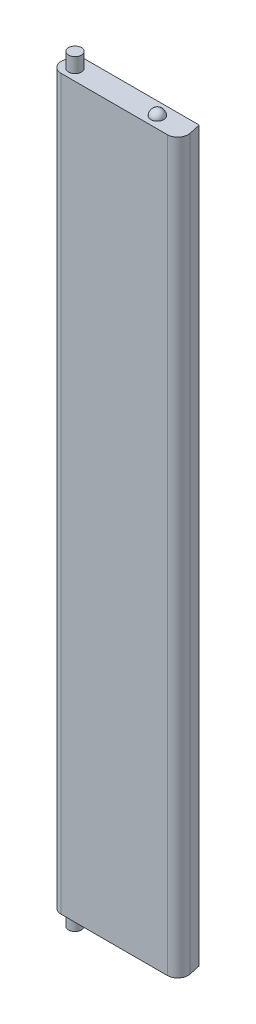
ISO-10303-21;
HEADER;
FILE_DESCRIPTION(('STEP AP214'),'2;1');
FILE_NAME('part.step','',(''),(''),'','','');
FILE_SCHEMA(('AUTOMOTIVE_DESIGN { 1 0 10303 214 1 1 1 1 }'));
ENDSEC;
DATA;
#1=APPLICATION_CONTEXT('core data for automotive mechanical design processes');
#2=APPLICATION_PROTOCOL_DEFINITION('international standard','automotive_design',2000,#1);
#3=PRODUCT_CONTEXT('',#1,'mechanical');
#4=PRODUCT('Part','Part','',(#3));
#5=PRODUCT_RELATED_PRODUCT_CATEGORY('part','',(#4));
#6=PRODUCT_DEFINITION_FORMATION('','',#4);
#7=PRODUCT_DEFINITION_CONTEXT('part definition',#1,'design');
#8=PRODUCT_DEFINITION('design','',#6,#7);
#9=PRODUCT_DEFINITION_SHAPE('','',#8);
#10=(LENGTH_UNIT() NAMED_UNIT(*) SI_UNIT(.MILLI.,.METRE.));
#11=(NAMED_UNIT(*) PLANE_ANGLE_UNIT() SI_UNIT($,.RADIAN.));
#12=(NAMED_UNIT(*) SI_UNIT($,.STERADIAN.) SOLID_ANGLE_UNIT());
#13=UNCERTAINTY_MEASURE_WITH_UNIT(LENGTH_MEASURE(1.E-05),#10,'distance_accuracy_value','');
#14=(GEOMETRIC_REPRESENTATION_CONTEXT(3) GLOBAL_UNCERTAINTY_ASSIGNED_CONTEXT((#13)) GLOBAL_UNIT_ASSIGNED_CONTEXT((#10,
#11,#12)) REPRESENTATION_CONTEXT('',''));
#15=CARTESIAN_POINT('',(0.,0.,0.));
#16=DIRECTION('',(0.,0.,1.));
#17=DIRECTION('',(1.,0.,0.));
#18=AXIS2_PLACEMENT_3D('',#15,#16,#17);
#19=CARTESIAN_POINT('',(87.875,0.95,16.1));
#20=DIRECTION('',(0.,0.,1.));
#21=DIRECTION('',(1.,0.,0.));
#22=AXIS2_PLACEMENT_3D('',#19,#20,#21);
#23=PLANE('',#22);
#24=DIRECTION('',(0.,1.,0.));
#25=VECTOR('',#24,1.);
#26=CARTESIAN_POINT('',(83.075,41.55,16.1));
#27=LINE('',#26,#25);
#28=CARTESIAN_POINT('',(83.075,41.55,16.1));
#29=VERTEX_POINT('',#28);
#30=CARTESIAN_POINT('',(83.075,-39.65,16.1));
#31=VERTEX_POINT('',#30);
#32=EDGE_CURVE('E272',#29,#31,#27,.F.);
#33=ORIENTED_EDGE('',*,*,#32,.F.);
#34=DIRECTION('',(1.,0.,0.));
#35=VECTOR('',#34,1.);
#36=CARTESIAN_POINT('',(92.675,41.55,16.1));
#37=LINE('',#36,#35);
#38=CARTESIAN_POINT('',(92.675,41.55,16.1));
#39=VERTEX_POINT('',#38);
#40=EDGE_CURVE('E260',#39,#29,#37,.F.);
#41=ORIENTED_EDGE('',*,*,#40,.F.);
#42=DIRECTION('',(0.,-1.,0.));
#43=VECTOR('',#42,1.);
#44=CARTESIAN_POINT('',(92.675,-39.65,16.1));
#45=LINE('',#44,#43);
#46=CARTESIAN_POINT('',(92.675,-39.65,16.1));
#47=VERTEX_POINT('',#46);
#48=EDGE_CURVE('E284',#47,#39,#45,.F.);
#49=ORIENTED_EDGE('',*,*,#48,.F.);
#50=DIRECTION('',(-1.,0.,0.));
#51=VECTOR('',#50,1.);
#52=CARTESIAN_POINT('',(83.075,-39.65,16.1));
#53=LINE('',#52,#51);
#54=EDGE_CURVE('E282',#31,#47,#53,.F.);
#55=ORIENTED_EDGE('',*,*,#54,.F.);
#56=EDGE_LOOP('',(#33,#41,#49,#55));
#57=FACE_BOUND('',#56,.T.);
#58=ADVANCED_FACE('F17',(#57),#23,.F.);
#59=CARTESIAN_POINT('',(82.05,44.65,16.));
#60=DIRECTION('',(0.,1.,0.));
#61=DIRECTION('',(-1.,0.,0.));
#62=AXIS2_PLACEMENT_3D('',#59,#60,#61);
#63=PLANE('',#62);
#64=CARTESIAN_POINT('',(82.0500000000001,44.65,16.));
#65=DIRECTION('',(0.,-1.,0.));
#66=DIRECTION('',(1.,0.,0.));
#67=AXIS2_PLACEMENT_3D('',#64,#65,#66);
#68=CIRCLE('',#67,0.75);
#69=CARTESIAN_POINT('',(82.8000000000001,44.65,16.));
#70=VERTEX_POINT('',#69);
#71=EDGE_CURVE('E20',#70,#70,#68,.T.);
#72=ORIENTED_EDGE('',*,*,#71,.F.);
#73=EDGE_LOOP('',(#72));
#74=FACE_BOUND('',#73,.T.);
#75=ADVANCED_FACE('F177',(#74),#63,.T.);
#76=CARTESIAN_POINT('',(92.675,-39.65,14.5));
#77=DIRECTION('',(-1.,0.,0.));
#78=DIRECTION('',(0.,-1.,0.));
#79=AXIS2_PLACEMENT_3D('',#76,#77,#78);
#80=PLANE('',#79);
#81=DIRECTION('',(0.,0.,1.));
#82=VECTOR('',#81,1.);
#83=CARTESIAN_POINT('',(92.675,41.55,14.5));
#84=LINE('',#83,#82);
#85=CARTESIAN_POINT('',(92.675,41.55,14.5));
#86=VERTEX_POINT('',#85);
#87=EDGE_CURVE('E274',#86,#39,#84,.T.);
#88=ORIENTED_EDGE('',*,*,#87,.F.);
#89=DIRECTION('',(0.,1.,0.));
#90=VECTOR('',#89,1.);
#91=CARTESIAN_POINT('',(92.675,-41.05,14.5));
#92=LINE('',#91,#90);
#93=CARTESIAN_POINT('',(92.675,-39.65,14.5));
#94=VERTEX_POINT('',#93);
#95=EDGE_CURVE('E134',#86,#94,#92,.F.);
#96=ORIENTED_EDGE('',*,*,#95,.T.);
#97=DIRECTION('',(0.,0.,1.));
#98=VECTOR('',#97,1.);
#99=CARTESIAN_POINT('',(92.675,-39.65,14.5));
#100=LINE('',#99,#98);
#101=EDGE_CURVE('E277',#47,#94,#100,.F.);
#102=ORIENTED_EDGE('',*,*,#101,.F.);
#103=ORIENTED_EDGE('',*,*,#48,.T.);
#104=EDGE_LOOP('',(#88,#96,#102,#103));
#105=FACE_BOUND('',#104,.T.);
#106=ADVANCED_FACE('F174',(#105),#80,.T.);
#107=CARTESIAN_POINT('',(83.075,-39.65,14.5));
#108=DIRECTION('',(0.,1.,0.));
#109=DIRECTION('',(-1.,0.,0.));
#110=AXIS2_PLACEMENT_3D('',#107,#108,#109);
#111=PLANE('',#110);
#112=ORIENTED_EDGE('',*,*,#101,.T.);
#113=DIRECTION('',(1.,0.,0.));
#114=VECTOR('',#113,1.);
#115=CARTESIAN_POINT('',(94.875,-39.65,14.5));
#116=LINE('',#115,#114);
#117=CARTESIAN_POINT('',(83.075,-39.65,14.5));
#118=VERTEX_POINT('',#117);
#119=EDGE_CURVE('E128',#94,#118,#116,.F.);
#120=ORIENTED_EDGE('',*,*,#119,.T.);
#121=DIRECTION('',(0.,0.,1.));
#122=VECTOR('',#121,1.);
#123=CARTESIAN_POINT('',(83.075,-39.65,14.5));
#124=LINE('',#123,#122);
#125=EDGE_CURVE('E271',#31,#118,#124,.F.);
#126=ORIENTED_EDGE('',*,*,#125,.F.);
#127=ORIENTED_EDGE('',*,*,#54,.T.);
#128=EDGE_LOOP('',(#112,#120,#126,#127));
#129=FACE_BOUND('',#128,.T.);
#130=ADVANCED_FACE('F170',(#129),#111,.T.);
#131=CARTESIAN_POINT('',(83.075,41.55,14.5));
#132=DIRECTION('',(1.,0.,0.));
#133=DIRECTION('',(0.,1.,0.));
#134=AXIS2_PLACEMENT_3D('',#131,#132,#133);
#135=PLANE('',#134);
#136=ORIENTED_EDGE('',*,*,#125,.T.);
#137=DIRECTION('',(0.,1.,0.));
#138=VECTOR('',#137,1.);
#139=CARTESIAN_POINT('',(83.075,-41.05,14.5));
#140=LINE('',#139,#138);
#141=CARTESIAN_POINT('',(83.075,41.55,14.5));
#142=VERTEX_POINT('',#141);
#143=EDGE_CURVE('E120',#118,#142,#140,.T.);
#144=ORIENTED_EDGE('',*,*,#143,.T.);
#145=DIRECTION('',(0.,0.,1.));
#146=VECTOR('',#145,1.);
#147=CARTESIAN_POINT('',(83.075,41.55,14.5));
#148=LINE('',#147,#146);
#149=EDGE_CURVE('E258',#29,#142,#148,.F.);
#150=ORIENTED_EDGE('',*,*,#149,.F.);
#151=ORIENTED_EDGE('',*,*,#32,.T.);
#152=EDGE_LOOP('',(#136,#144,#150,#151));
#153=FACE_BOUND('',#152,.T.);
#154=ADVANCED_FACE('F167',(#153),#135,.T.);
#155=CARTESIAN_POINT('',(92.675,41.55,14.5));
#156=DIRECTION('',(0.,-1.,0.));
#157=DIRECTION('',(1.,0.,0.));
#158=AXIS2_PLACEMENT_3D('',#155,#156,#157);
#159=PLANE('',#158);
#160=ORIENTED_EDGE('',*,*,#149,.T.);
#161=DIRECTION('',(1.,0.,0.));
#162=VECTOR('',#161,1.);
#163=CARTESIAN_POINT('',(94.875,41.55,14.5));
#164=LINE('',#163,#162);
#165=EDGE_CURVE('E114',#142,#86,#164,.T.);
#166=ORIENTED_EDGE('',*,*,#165,.T.);
#167=ORIENTED_EDGE('',*,*,#87,.T.);
#168=ORIENTED_EDGE('',*,*,#40,.T.);
#169=EDGE_LOOP('',(#160,#166,#167,#168));
#170=FACE_BOUND('',#169,.T.);
#171=ADVANCED_FACE('F163',(#170),#159,.T.);
#172=CARTESIAN_POINT('',(82.05,-42.75,16.));
#173=DIRECTION('',(0.,1.,0.));
#174=DIRECTION('',(-1.,0.,0.));
#175=AXIS2_PLACEMENT_3D('',#172,#173,#174);
#176=PLANE('',#175);
#177=CARTESIAN_POINT('',(82.05,-42.75,16.));
#178=DIRECTION('',(0.,-1.,0.));
#179=DIRECTION('',(1.,0.,0.));
#180=AXIS2_PLACEMENT_3D('',#177,#178,#179);
#181=CIRCLE('',#180,0.75);
#182=CARTESIAN_POINT('',(82.8,-42.75,16.));
#183=VERTEX_POINT('',#182);
#184=EDGE_CURVE('E112',#183,#183,#181,.F.);
#185=ORIENTED_EDGE('',*,*,#184,.F.);
#186=EDGE_LOOP('',(#185));
#187=FACE_BOUND('',#186,.T.);
#188=ADVANCED_FACE('F159',(#187),#176,.F.);
#189=CARTESIAN_POINT('',(80.875,-41.05,14.5));
#190=DIRECTION('',(0.976384584304589,0.,0.216039680457909));
#191=DIRECTION('',(0.216039680457909,0.,-0.976384584304589));
#192=AXIS2_PLACEMENT_3D('',#189,#190,#191);
#193=PLANE('',#192);
#194=DIRECTION('',(0.,-1.,0.));
#195=VECTOR('',#194,1.);
#196=CARTESIAN_POINT('',(80.5783384988346,-41.05,15.84075238345));
#197=LINE('',#196,#195);
#198=CARTESIAN_POINT('',(80.578338498835,42.95,15.8407523834503));
#199=VERTEX_POINT('',#198);
#200=CARTESIAN_POINT('',(80.578338498835,-41.05,15.8407523834503));
#201=VERTEX_POINT('',#200);
#202=EDGE_CURVE('E94',#199,#201,#197,.T.);
#203=ORIENTED_EDGE('',*,*,#202,.F.);
#204=DIRECTION('',(0.216039680457909,0.,-0.976384584304589));
#205=VECTOR('',#204,1.);
#206=CARTESIAN_POINT('',(80.875,42.95,14.5));
#207=LINE('',#206,#205);
#208=CARTESIAN_POINT('',(80.875,42.95,14.5));
#209=VERTEX_POINT('',#208);
#210=EDGE_CURVE('E262',#209,#199,#207,.F.);
#211=ORIENTED_EDGE('',*,*,#210,.F.);
#212=DIRECTION('',(0.,1.,0.));
#213=VECTOR('',#212,1.);
#214=CARTESIAN_POINT('',(80.875,-41.05,14.5));
#215=LINE('',#214,#213);
#216=CARTESIAN_POINT('',(80.875,-41.05,14.5));
#217=VERTEX_POINT('',#216);
#218=EDGE_CURVE('E136',#209,#217,#215,.F.);
#219=ORIENTED_EDGE('',*,*,#218,.T.);
#220=DIRECTION('',(0.216039680457909,0.,-0.976384584304589));
#221=VECTOR('',#220,1.);
#222=CARTESIAN_POINT('',(80.875,-41.05,14.5));
#223=LINE('',#222,#221);
#224=EDGE_CURVE('E229',#201,#217,#223,.T.);
#225=ORIENTED_EDGE('',*,*,#224,.F.);
#226=EDGE_LOOP('',(#203,#211,#219,#225));
#227=FACE_BOUND('',#226,.T.);
#228=ADVANCED_FACE('F155',(#227),#193,.F.);
#229=CARTESIAN_POINT('',(82.05,-42.75,16.));
#230=DIRECTION('',(0.,-1.,0.));
#231=DIRECTION('',(1.,0.,0.));
#232=AXIS2_PLACEMENT_3D('',#229,#230,#231);
#233=CYLINDRICAL_SURFACE('',#232,0.75);
#234=ORIENTED_EDGE('',*,*,#71,.T.);
#235=EDGE_LOOP('',(#234));
#236=FACE_BOUND('',#235,.T.);
#237=CARTESIAN_POINT('',(82.0500000000001,42.95,16.));
#238=DIRECTION('',(0.,-1.,0.));
#239=DIRECTION('',(1.,0.,0.));
#240=AXIS2_PLACEMENT_3D('',#237,#238,#239);
#241=CIRCLE('',#240,0.75);
#242=CARTESIAN_POINT('',(82.8000000000001,42.95,16.));
#243=VERTEX_POINT('',#242);
#244=EDGE_CURVE('E108',#243,#243,#241,.T.);
#245=ORIENTED_EDGE('',*,*,#244,.F.);
#246=EDGE_LOOP('',(#245));
#247=FACE_BOUND('',#246,.T.);
#248=ADVANCED_FACE('F150',(#236,#247),#233,.T.);
#249=CARTESIAN_POINT('',(91.55,42.95,16.));
#250=DIRECTION('',(1.,0.,0.));
#251=DIRECTION('',(0.,0.,-1.));
#252=AXIS2_PLACEMENT_3D('',#249,#250,#251);
#253=SPHERICAL_SURFACE('',#252,0.75);
#254=CARTESIAN_POINT('',(91.55,42.95,16.));
#255=DIRECTION('',(0.,-1.,0.));
#256=DIRECTION('',(1.,0.,0.));
#257=AXIS2_PLACEMENT_3D('',#254,#255,#256);
#258=CIRCLE('',#257,0.75);
#259=CARTESIAN_POINT('',(92.3,42.95,16.));
#260=VERTEX_POINT('',#259);
#261=CARTESIAN_POINT('',(90.8,42.95,16.));
#262=VERTEX_POINT('',#261);
#263=EDGE_CURVE('E33',#260,#262,#258,.T.);
#264=ORIENTED_EDGE('',*,*,#263,.F.);
#265=CARTESIAN_POINT('',(91.55,42.95,16.));
#266=DIRECTION('',(0.,-1.,0.));
#267=DIRECTION('',(1.,0.,0.));
#268=AXIS2_PLACEMENT_3D('',#265,#266,#267);
#269=CIRCLE('',#268,0.75);
#270=EDGE_CURVE('E106',#262,#260,#269,.T.);
#271=ORIENTED_EDGE('',*,*,#270,.F.);
#272=EDGE_LOOP('',(#264,#271));
#273=FACE_BOUND('',#272,.T.);
#274=ADVANCED_FACE('F146',(#273),#253,.T.);
#275=CARTESIAN_POINT('',(95.171661501165,-41.05,15.84075238345));
#276=DIRECTION('',(-0.976384584304589,0.,0.216039680457909));
#277=DIRECTION('',(0.216039680457909,0.,0.976384584304589));
#278=AXIS2_PLACEMENT_3D('',#275,#276,#277);
#279=PLANE('',#278);
#280=DIRECTION('',(0.,1.,0.));
#281=VECTOR('',#280,1.);
#282=CARTESIAN_POINT('',(94.875,-41.05,14.5));
#283=LINE('',#282,#281);
#284=CARTESIAN_POINT('',(94.8750000000002,-41.05,14.5));
#285=VERTEX_POINT('',#284);
#286=CARTESIAN_POINT('',(94.875,42.95,14.5));
#287=VERTEX_POINT('',#286);
#288=EDGE_CURVE('E89',#285,#287,#283,.T.);
#289=ORIENTED_EDGE('',*,*,#288,.T.);
#290=DIRECTION('',(-0.216039680458227,0.,-0.976384584304518));
#291=VECTOR('',#290,1.);
#292=CARTESIAN_POINT('',(95.171661501165,42.95,15.84075238345));
#293=LINE('',#292,#291);
#294=CARTESIAN_POINT('',(95.1716615011652,42.95,15.84075238345));
#295=VERTEX_POINT('',#294);
#296=EDGE_CURVE('E85',#295,#287,#293,.T.);
#297=ORIENTED_EDGE('',*,*,#296,.F.);
#298=DIRECTION('',(0.,-1.,0.));
#299=VECTOR('',#298,1.);
#300=CARTESIAN_POINT('',(95.1716615011654,-41.05,15.8407523834499));
#301=LINE('',#300,#299);
#302=CARTESIAN_POINT('',(95.1716615011652,-41.05,15.8407523834503));
#303=VERTEX_POINT('',#302);
#304=EDGE_CURVE('E73',#303,#295,#301,.F.);
#305=ORIENTED_EDGE('',*,*,#304,.F.);
#306=DIRECTION('',(0.216039680457909,0.,0.976384584304589));
#307=VECTOR('',#306,1.);
#308=CARTESIAN_POINT('',(95.171661501165,-41.05,15.84075238345));
#309=LINE('',#308,#307);
#310=EDGE_CURVE('E138',#285,#303,#309,.T.);
#311=ORIENTED_EDGE('',*,*,#310,.F.);
#312=EDGE_LOOP('',(#289,#297,#305,#311));
#313=FACE_BOUND('',#312,.T.);
#314=ADVANCED_FACE('F86',(#313),#279,.F.);
#315=CARTESIAN_POINT('',(94.875,-41.05,14.5));
#316=DIRECTION('',(0.,0.,1.));
#317=DIRECTION('',(1.,0.,0.));
#318=AXIS2_PLACEMENT_3D('',#315,#316,#317);
#319=PLANE('',#318);
#320=ORIENTED_EDGE('',*,*,#143,.F.);
#321=ORIENTED_EDGE('',*,*,#119,.F.);
#322=ORIENTED_EDGE('',*,*,#95,.F.);
#323=ORIENTED_EDGE('',*,*,#165,.F.);
#324=EDGE_LOOP('',(#320,#321,#322,#323));
#325=FACE_BOUND('',#324,.T.);
#326=ORIENTED_EDGE('',*,*,#218,.F.);
#327=DIRECTION('',(-1.,0.,0.));
#328=VECTOR('',#327,1.);
#329=CARTESIAN_POINT('',(87.875,42.95,14.5));
#330=LINE('',#329,#328);
#331=EDGE_CURVE('E93',#287,#209,#330,.T.);
#332=ORIENTED_EDGE('',*,*,#331,.F.);
#333=ORIENTED_EDGE('',*,*,#288,.F.);
#334=DIRECTION('',(-1.,0.,0.));
#335=VECTOR('',#334,1.);
#336=CARTESIAN_POINT('',(87.875,-41.05,14.5));
#337=LINE('',#336,#335);
#338=EDGE_CURVE('E101',#285,#217,#337,.T.);
#339=ORIENTED_EDGE('',*,*,#338,.T.);
#340=EDGE_LOOP('',(#326,#332,#333,#339));
#341=FACE_BOUND('',#340,.T.);
#342=ADVANCED_FACE('F266',(#325,#341),#319,.F.);
#343=CARTESIAN_POINT('',(82.05,-42.75,16.));
#344=DIRECTION('',(0.,-1.,0.));
#345=DIRECTION('',(1.,0.,0.));
#346=AXIS2_PLACEMENT_3D('',#343,#344,#345);
#347=CYLINDRICAL_SURFACE('',#346,0.75);
#348=CARTESIAN_POINT('',(82.05,-41.05,16.));
#349=DIRECTION('',(0.,-1.,0.));
#350=DIRECTION('',(1.,0.,0.));
#351=AXIS2_PLACEMENT_3D('',#348,#349,#350);
#352=CIRCLE('',#351,0.75);
#353=CARTESIAN_POINT('',(82.8,-41.05,16.));
#354=VERTEX_POINT('',#353);
#355=EDGE_CURVE('E295',#354,#354,#352,.T.);
#356=ORIENTED_EDGE('',*,*,#355,.T.);
#357=EDGE_LOOP('',(#356));
#358=FACE_BOUND('',#357,.T.);
#359=ORIENTED_EDGE('',*,*,#184,.T.);
#360=EDGE_LOOP('',(#359));
#361=FACE_BOUND('',#360,.T.);
#362=ADVANCED_FACE('F208',(#358,#361),#347,.T.);
#363=CARTESIAN_POINT('',(91.55,-41.05,16.));
#364=DIRECTION('',(1.,0.,0.));
#365=DIRECTION('',(0.,0.,1.));
#366=AXIS2_PLACEMENT_3D('',#363,#364,#365);
#367=SPHERICAL_SURFACE('',#366,0.75);
#368=CARTESIAN_POINT('',(91.55,-41.05,16.));
#369=DIRECTION('',(0.,-1.,0.));
#370=DIRECTION('',(1.,0.,0.));
#371=AXIS2_PLACEMENT_3D('',#368,#369,#370);
#372=CIRCLE('',#371,0.75);
#373=CARTESIAN_POINT('',(90.8,-41.05,16.));
#374=VERTEX_POINT('',#373);
#375=CARTESIAN_POINT('',(92.3,-41.05,16.));
#376=VERTEX_POINT('',#375);
#377=EDGE_CURVE('E217',#374,#376,#372,.T.);
#378=ORIENTED_EDGE('',*,*,#377,.T.);
#379=CARTESIAN_POINT('',(91.55,-41.05,16.));
#380=DIRECTION('',(0.,-1.,0.));
#381=DIRECTION('',(1.,0.,0.));
#382=AXIS2_PLACEMENT_3D('',#379,#380,#381);
#383=CIRCLE('',#382,0.75);
#384=EDGE_CURVE('E54',#376,#374,#383,.T.);
#385=ORIENTED_EDGE('',*,*,#384,.T.);
#386=EDGE_LOOP('',(#378,#385));
#387=FACE_BOUND('',#386,.T.);
#388=ADVANCED_FACE('F204',(#387),#367,.T.);
#389=CARTESIAN_POINT('',(81.75,-41.05,16.1));
#390=DIRECTION('',(0.,-1.,0.));
#391=DIRECTION('',(1.,0.,0.));
#392=AXIS2_PLACEMENT_3D('',#389,#390,#391);
#393=CYLINDRICAL_SURFACE('',#392,1.2);
#394=CARTESIAN_POINT('',(81.7500000000001,42.95,16.1));
#395=DIRECTION('',(0.,-1.,0.));
#396=DIRECTION('',(1.,0.,0.));
#397=AXIS2_PLACEMENT_3D('',#394,#395,#396);
#398=CIRCLE('',#397,1.2);
#399=CARTESIAN_POINT('',(81.75,42.95,17.3));
#400=VERTEX_POINT('',#399);
#401=EDGE_CURVE('E111',#199,#400,#398,.F.);
#402=ORIENTED_EDGE('',*,*,#401,.F.);
#403=ORIENTED_EDGE('',*,*,#202,.T.);
#404=CARTESIAN_POINT('',(81.75,-41.05,16.1));
#405=DIRECTION('',(0.,-1.,0.));
#406=DIRECTION('',(1.,0.,0.));
#407=AXIS2_PLACEMENT_3D('',#404,#405,#406);
#408=CIRCLE('',#407,1.2);
#409=CARTESIAN_POINT('',(81.75,-41.05,17.3));
#410=VERTEX_POINT('',#409);
#411=EDGE_CURVE('E224',#201,#410,#408,.F.);
#412=ORIENTED_EDGE('',*,*,#411,.T.);
#413=DIRECTION('',(0.,1.,0.));
#414=VECTOR('',#413,1.);
#415=CARTESIAN_POINT('',(81.75,-41.05,17.3));
#416=LINE('',#415,#414);
#417=EDGE_CURVE('E215',#410,#400,#416,.T.);
#418=ORIENTED_EDGE('',*,*,#417,.T.);
#419=EDGE_LOOP('',(#402,#403,#412,#418));
#420=FACE_BOUND('',#419,.T.);
#421=ADVANCED_FACE('F201',(#420),#393,.T.);
#422=CARTESIAN_POINT('',(87.875,42.95,15.872310861159));
#423=DIRECTION('',(0.,1.,0.));
#424=DIRECTION('',(-1.,0.,0.));
#425=AXIS2_PLACEMENT_3D('',#422,#423,#424);
#426=PLANE('',#425);
#427=ORIENTED_EDGE('',*,*,#263,.T.);
#428=ORIENTED_EDGE('',*,*,#270,.T.);
#429=EDGE_LOOP('',(#427,#428));
#430=FACE_BOUND('',#429,.T.);
#431=ORIENTED_EDGE('',*,*,#244,.T.);
#432=EDGE_LOOP('',(#431));
#433=FACE_BOUND('',#432,.T.);
#434=ORIENTED_EDGE('',*,*,#210,.T.);
#435=ORIENTED_EDGE('',*,*,#401,.T.);
#436=DIRECTION('',(-1.,0.,0.));
#437=VECTOR('',#436,1.);
#438=CARTESIAN_POINT('',(81.75,42.95,17.3));
#439=LINE('',#438,#437);
#440=CARTESIAN_POINT('',(94.,42.95,17.3));
#441=VERTEX_POINT('',#440);
#442=EDGE_CURVE('E99',#400,#441,#439,.F.);
#443=ORIENTED_EDGE('',*,*,#442,.T.);
#444=CARTESIAN_POINT('',(94.0000000000001,42.95,16.1));
#445=DIRECTION('',(0.,-1.,0.));
#446=DIRECTION('',(1.,0.,0.));
#447=AXIS2_PLACEMENT_3D('',#444,#445,#446);
#448=CIRCLE('',#447,1.2);
#449=EDGE_CURVE('E78',#295,#441,#448,.T.);
#450=ORIENTED_EDGE('',*,*,#449,.F.);
#451=ORIENTED_EDGE('',*,*,#296,.T.);
#452=ORIENTED_EDGE('',*,*,#331,.T.);
#453=EDGE_LOOP('',(#434,#435,#443,#450,#451,#452));
#454=FACE_BOUND('',#453,.T.);
#455=ADVANCED_FACE('F97',(#430,#433,#454),#426,.T.);
#456=CARTESIAN_POINT('',(94.,-41.05,16.1));
#457=DIRECTION('',(0.,-1.,0.));
#458=DIRECTION('',(1.,0.,0.));
#459=AXIS2_PLACEMENT_3D('',#456,#457,#458);
#460=CYLINDRICAL_SURFACE('',#459,1.2);
#461=ORIENTED_EDGE('',*,*,#449,.T.);
#462=DIRECTION('',(0.,1.,0.));
#463=VECTOR('',#462,1.);
#464=CARTESIAN_POINT('',(94.,-41.05,17.3));
#465=LINE('',#464,#463);
#466=CARTESIAN_POINT('',(94.,-41.05,17.3));
#467=VERTEX_POINT('',#466);
#468=EDGE_CURVE('E26',#441,#467,#465,.F.);
#469=ORIENTED_EDGE('',*,*,#468,.T.);
#470=CARTESIAN_POINT('',(94.,-41.05,16.1));
#471=DIRECTION('',(0.,-1.,0.));
#472=DIRECTION('',(1.,0.,0.));
#473=AXIS2_PLACEMENT_3D('',#470,#471,#472);
#474=CIRCLE('',#473,1.2);
#475=EDGE_CURVE('E62',#467,#303,#474,.F.);
#476=ORIENTED_EDGE('',*,*,#475,.T.);
#477=ORIENTED_EDGE('',*,*,#304,.T.);
#478=EDGE_LOOP('',(#461,#469,#476,#477));
#479=FACE_BOUND('',#478,.T.);
#480=ADVANCED_FACE('F75',(#479),#460,.T.);
#481=CARTESIAN_POINT('',(87.875,-41.05,15.872310861159));
#482=DIRECTION('',(0.,1.,0.));
#483=DIRECTION('',(-1.,0.,0.));
#484=AXIS2_PLACEMENT_3D('',#481,#482,#483);
#485=PLANE('',#484);
#486=ORIENTED_EDGE('',*,*,#377,.F.);
#487=ORIENTED_EDGE('',*,*,#384,.F.);
#488=EDGE_LOOP('',(#486,#487));
#489=FACE_BOUND('',#488,.T.);
#490=ORIENTED_EDGE('',*,*,#355,.F.);
#491=EDGE_LOOP('',(#490));
#492=FACE_BOUND('',#491,.T.);
#493=ORIENTED_EDGE('',*,*,#224,.T.);
#494=ORIENTED_EDGE('',*,*,#338,.F.);
#495=ORIENTED_EDGE('',*,*,#310,.T.);
#496=ORIENTED_EDGE('',*,*,#475,.F.);
#497=DIRECTION('',(-1.,0.,0.));
#498=VECTOR('',#497,1.);
#499=CARTESIAN_POINT('',(81.75,-41.05,17.3));
#500=LINE('',#499,#498);
#501=EDGE_CURVE('E11',#467,#410,#500,.T.);
#502=ORIENTED_EDGE('',*,*,#501,.T.);
#503=ORIENTED_EDGE('',*,*,#411,.F.);
#504=EDGE_LOOP('',(#493,#494,#495,#496,#502,#503));
#505=FACE_BOUND('',#504,.T.);
#506=ADVANCED_FACE('F189',(#489,#492,#505),#485,.F.);
#507=CARTESIAN_POINT('',(81.75,-41.05,17.3));
#508=DIRECTION('',(0.,0.,-1.));
#509=DIRECTION('',(-1.,0.,0.));
#510=AXIS2_PLACEMENT_3D('',#507,#508,#509);
#511=PLANE('',#510);
#512=ORIENTED_EDGE('',*,*,#468,.F.);
#513=ORIENTED_EDGE('',*,*,#442,.F.);
#514=ORIENTED_EDGE('',*,*,#417,.F.);
#515=ORIENTED_EDGE('',*,*,#501,.F.);
#516=EDGE_LOOP('',(#512,#513,#514,#515));
#517=FACE_BOUND('',#516,.T.);
#518=ADVANCED_FACE('F187',(#517),#511,.F.);
#519=CLOSED_SHELL('',(#58,#75,#106,#130,#154,#171,#188,#228,#248,#274,#314,#342,#362,#388,#421,
#455,#480,#506,#518));
#520=MANIFOLD_SOLID_BREP('B1',#519);
#521=ADVANCED_BREP_SHAPE_REPRESENTATION('',(#18,#520),#14);
#522=SHAPE_DEFINITION_REPRESENTATION(#9,#521);
ENDSEC;
END-ISO-10303-21;
